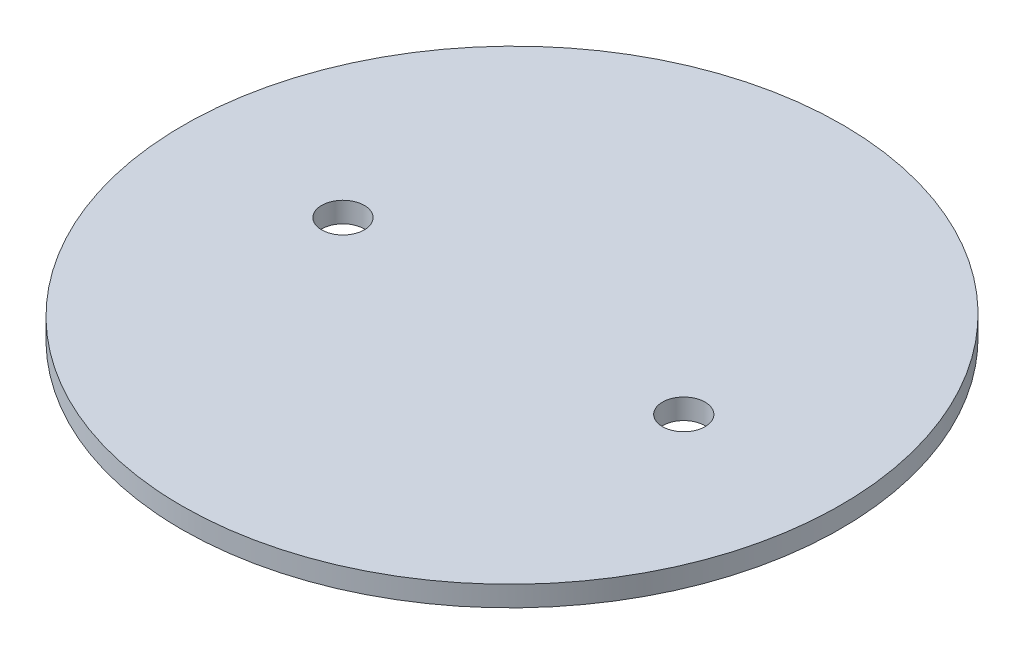
ISO-10303-21;
HEADER;
FILE_DESCRIPTION(('STEP AP214'),'2;1');
FILE_NAME('part.step','',(''),(''),'','','');
FILE_SCHEMA(('AUTOMOTIVE_DESIGN { 1 0 10303 214 1 1 1 1 }'));
ENDSEC;
DATA;
#1=APPLICATION_CONTEXT('core data for automotive mechanical design processes');
#2=APPLICATION_PROTOCOL_DEFINITION('international standard','automotive_design',2000,#1);
#3=PRODUCT_CONTEXT('',#1,'mechanical');
#4=PRODUCT('Part','Part','',(#3));
#5=PRODUCT_RELATED_PRODUCT_CATEGORY('part','',(#4));
#6=PRODUCT_DEFINITION_FORMATION('','',#4);
#7=PRODUCT_DEFINITION_CONTEXT('part definition',#1,'design');
#8=PRODUCT_DEFINITION('design','',#6,#7);
#9=PRODUCT_DEFINITION_SHAPE('','',#8);
#10=(LENGTH_UNIT() NAMED_UNIT(*) SI_UNIT(.MILLI.,.METRE.));
#11=(NAMED_UNIT(*) PLANE_ANGLE_UNIT() SI_UNIT($,.RADIAN.));
#12=(NAMED_UNIT(*) SI_UNIT($,.STERADIAN.) SOLID_ANGLE_UNIT());
#13=UNCERTAINTY_MEASURE_WITH_UNIT(LENGTH_MEASURE(1.E-05),#10,'distance_accuracy_value','');
#14=(GEOMETRIC_REPRESENTATION_CONTEXT(3) GLOBAL_UNCERTAINTY_ASSIGNED_CONTEXT((#13)) GLOBAL_UNIT_ASSIGNED_CONTEXT((#10,
#11,#12)) REPRESENTATION_CONTEXT('',''));
#15=CARTESIAN_POINT('',(0.,0.,0.));
#16=DIRECTION('',(0.,0.,1.));
#17=DIRECTION('',(1.,0.,0.));
#18=AXIS2_PLACEMENT_3D('',#15,#16,#17);
#19=CARTESIAN_POINT('',(0.,2.99999999999989,0.));
#20=DIRECTION('',(0.,1.,0.));
#21=DIRECTION('',(0.,0.,1.));
#22=AXIS2_PLACEMENT_3D('',#19,#20,#21);
#23=PLANE('',#22);
#24=CARTESIAN_POINT('',(-49.6000000000001,2.999999999999,3.33066907387547E-13));
#25=DIRECTION('',(0.,1.,0.));
#26=DIRECTION('',(0.,0.,1.));
#27=AXIS2_PLACEMENT_3D('',#24,#25,#26);
#28=CIRCLE('',#27,6.25);
#29=CARTESIAN_POINT('',(-49.6000000000001,2.999999999999,6.25000000000033));
#30=VERTEX_POINT('',#29);
#31=EDGE_CURVE('E52',#30,#30,#28,.T.);
#32=ORIENTED_EDGE('',*,*,#31,.F.);
#33=EDGE_LOOP('',(#32));
#34=FACE_BOUND('',#33,.T.);
#35=CARTESIAN_POINT('',(0.,2.99999999999989,0.));
#36=DIRECTION('',(0.,1.,0.));
#37=DIRECTION('',(0.,0.,1.));
#38=AXIS2_PLACEMENT_3D('',#35,#36,#37);
#39=ELLIPSE('',#38,96.9,96.5);
#40=CARTESIAN_POINT('',(0.,2.99999999999989,96.9));
#41=VERTEX_POINT('',#40);
#42=EDGE_CURVE('E10',#41,#41,#39,.T.);
#43=ORIENTED_EDGE('',*,*,#42,.T.);
#44=EDGE_LOOP('',(#43));
#45=FACE_BOUND('',#44,.T.);
#46=CARTESIAN_POINT('',(50.4,2.99999999999878,-3.33066907387547E-13));
#47=DIRECTION('',(0.,1.,0.));
#48=DIRECTION('',(0.,0.,1.));
#49=AXIS2_PLACEMENT_3D('',#46,#47,#48);
#50=CIRCLE('',#49,6.25000000000001);
#51=CARTESIAN_POINT('',(50.4,2.99999999999878,6.24999999999967));
#52=VERTEX_POINT('',#51);
#53=EDGE_CURVE('E58',#52,#52,#50,.T.);
#54=ORIENTED_EDGE('',*,*,#53,.F.);
#55=EDGE_LOOP('',(#54));
#56=FACE_BOUND('',#55,.T.);
#57=ADVANCED_FACE('F39',(#34,#45,#56),#23,.T.);
#58=CARTESIAN_POINT('',(0.,-2.99999999999878,-4.44089209850063E-13));
#59=DIRECTION('',(0.,1.,0.));
#60=DIRECTION('',(0.,0.,1.));
#61=AXIS2_PLACEMENT_3D('',#58,#59,#60);
#62=PLANE('',#61);
#63=CARTESIAN_POINT('',(0.,-2.99999999999878,-4.44089209850063E-13));
#64=DIRECTION('',(0.,1.,0.));
#65=DIRECTION('',(0.,0.,1.));
#66=AXIS2_PLACEMENT_3D('',#63,#64,#65);
#67=ELLIPSE('',#66,96.9,96.5);
#68=CARTESIAN_POINT('',(0.,-2.99999999999878,96.8999999999996));
#69=VERTEX_POINT('',#68);
#70=EDGE_CURVE('E42',#69,#69,#67,.T.);
#71=ORIENTED_EDGE('',*,*,#70,.F.);
#72=EDGE_LOOP('',(#71));
#73=FACE_BOUND('',#72,.T.);
#74=CARTESIAN_POINT('',(-49.6000000000001,-2.999999999999,7.7715611723761E-13));
#75=DIRECTION('',(0.,1.,0.));
#76=DIRECTION('',(0.,0.,1.));
#77=AXIS2_PLACEMENT_3D('',#74,#75,#76);
#78=CIRCLE('',#77,6.25);
#79=CARTESIAN_POINT('',(-49.6000000000001,-2.999999999999,6.25000000000078));
#80=VERTEX_POINT('',#79);
#81=EDGE_CURVE('E57',#80,#80,#78,.T.);
#82=ORIENTED_EDGE('',*,*,#81,.T.);
#83=EDGE_LOOP('',(#82));
#84=FACE_BOUND('',#83,.T.);
#85=CARTESIAN_POINT('',(50.4,-3.00000000000011,-1.11022302462516E-13));
#86=DIRECTION('',(0.,1.,0.));
#87=DIRECTION('',(0.,0.,1.));
#88=AXIS2_PLACEMENT_3D('',#85,#86,#87);
#89=CIRCLE('',#88,6.25000000000001);
#90=CARTESIAN_POINT('',(50.4,-3.00000000000011,6.2499999999999));
#91=VERTEX_POINT('',#90);
#92=EDGE_CURVE('E61',#91,#91,#89,.T.);
#93=ORIENTED_EDGE('',*,*,#92,.T.);
#94=EDGE_LOOP('',(#93));
#95=FACE_BOUND('',#94,.T.);
#96=ADVANCED_FACE('F80',(#73,#84,#95),#62,.F.);
#97=DIRECTION('',(0.,-1.,0.));
#98=VECTOR('',#97,1.);
#99=SURFACE_OF_LINEAR_EXTRUSION('',#39,#98);
#100=ORIENTED_EDGE('',*,*,#42,.F.);
#101=EDGE_LOOP('',(#100));
#102=FACE_BOUND('',#101,.T.);
#103=ORIENTED_EDGE('',*,*,#70,.T.);
#104=EDGE_LOOP('',(#103));
#105=FACE_BOUND('',#104,.T.);
#106=ADVANCED_FACE('F41',(#102,#105),#99,.F.);
#107=CARTESIAN_POINT('',(-49.6000000000001,2.999999999999,3.33066907387547E-13));
#108=DIRECTION('',(0.,-1.,0.));
#109=DIRECTION('',(0.,0.,-1.));
#110=AXIS2_PLACEMENT_3D('',#107,#108,#109);
#111=CYLINDRICAL_SURFACE('',#110,6.25);
#112=ORIENTED_EDGE('',*,*,#31,.T.);
#113=EDGE_LOOP('',(#112));
#114=FACE_BOUND('',#113,.T.);
#115=ORIENTED_EDGE('',*,*,#81,.F.);
#116=EDGE_LOOP('',(#115));
#117=FACE_BOUND('',#116,.T.);
#118=ADVANCED_FACE('F88',(#114,#117),#111,.F.);
#119=CARTESIAN_POINT('',(50.4,2.99999999999878,-3.33066907387547E-13));
#120=DIRECTION('',(0.,-1.,0.));
#121=DIRECTION('',(0.,0.,-1.));
#122=AXIS2_PLACEMENT_3D('',#119,#120,#121);
#123=CYLINDRICAL_SURFACE('',#122,6.25000000000001);
#124=ORIENTED_EDGE('',*,*,#53,.T.);
#125=EDGE_LOOP('',(#124));
#126=FACE_BOUND('',#125,.T.);
#127=ORIENTED_EDGE('',*,*,#92,.F.);
#128=EDGE_LOOP('',(#127));
#129=FACE_BOUND('',#128,.T.);
#130=ADVANCED_FACE('F71',(#126,#129),#123,.F.);
#131=CLOSED_SHELL('',(#57,#96,#106,#118,#130));
#132=MANIFOLD_SOLID_BREP('B2',#131);
#133=ADVANCED_BREP_SHAPE_REPRESENTATION('',(#18,#132),#14);
#134=SHAPE_DEFINITION_REPRESENTATION(#9,#133);
ENDSEC;
END-ISO-10303-21;
